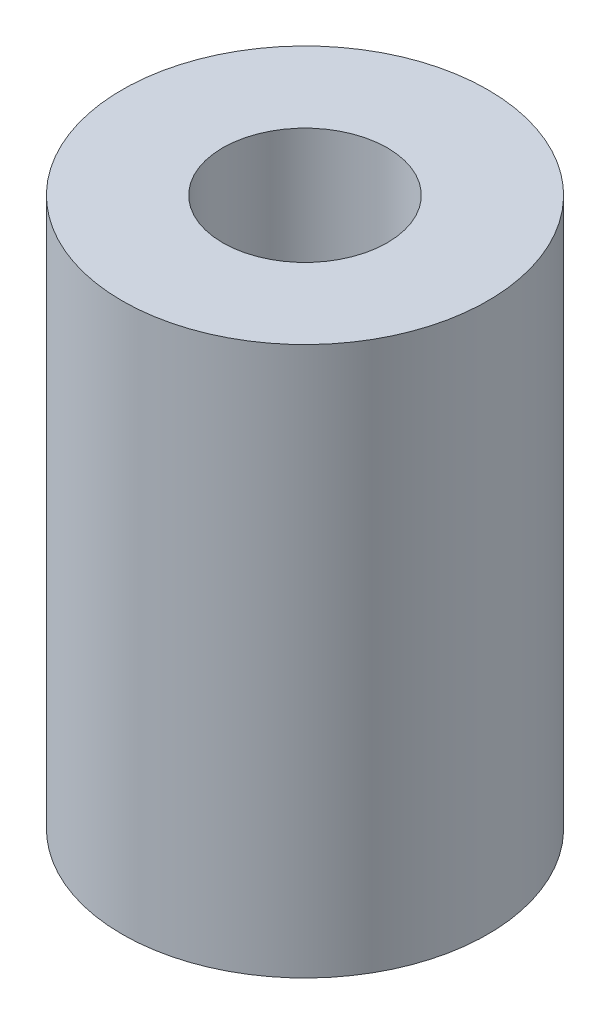
ISO-10303-21;
HEADER;
FILE_DESCRIPTION(('STEP AP214'),'2;1');
FILE_NAME('part.step','',(''),(''),'','','');
FILE_SCHEMA(('AUTOMOTIVE_DESIGN { 1 0 10303 214 1 1 1 1 }'));
ENDSEC;
DATA;
#1=APPLICATION_CONTEXT('core data for automotive mechanical design processes');
#2=APPLICATION_PROTOCOL_DEFINITION('international standard','automotive_design',2000,#1);
#3=PRODUCT_CONTEXT('',#1,'mechanical');
#4=PRODUCT('Part','Part','',(#3));
#5=PRODUCT_RELATED_PRODUCT_CATEGORY('part','',(#4));
#6=PRODUCT_DEFINITION_FORMATION('','',#4);
#7=PRODUCT_DEFINITION_CONTEXT('part definition',#1,'design');
#8=PRODUCT_DEFINITION('design','',#6,#7);
#9=PRODUCT_DEFINITION_SHAPE('','',#8);
#10=(LENGTH_UNIT() NAMED_UNIT(*) SI_UNIT(.MILLI.,.METRE.));
#11=(NAMED_UNIT(*) PLANE_ANGLE_UNIT() SI_UNIT($,.RADIAN.));
#12=(NAMED_UNIT(*) SI_UNIT($,.STERADIAN.) SOLID_ANGLE_UNIT());
#13=UNCERTAINTY_MEASURE_WITH_UNIT(LENGTH_MEASURE(1.E-05),#10,'distance_accuracy_value','');
#14=(GEOMETRIC_REPRESENTATION_CONTEXT(3) GLOBAL_UNCERTAINTY_ASSIGNED_CONTEXT((#13)) GLOBAL_UNIT_ASSIGNED_CONTEXT((#10,
#11,#12)) REPRESENTATION_CONTEXT('',''));
#15=CARTESIAN_POINT('',(0.,0.,0.));
#16=DIRECTION('',(0.,0.,1.));
#17=DIRECTION('',(1.,0.,0.));
#18=AXIS2_PLACEMENT_3D('',#15,#16,#17);
#19=CARTESIAN_POINT('',(0.,0.,0.));
#20=DIRECTION('',(0.,1.,0.));
#21=DIRECTION('',(0.,0.,1.));
#22=AXIS2_PLACEMENT_3D('',#19,#20,#21);
#23=CYLINDRICAL_SURFACE('',#22,5.715);
#24=CARTESIAN_POINT('',(0.,38.1,0.));
#25=DIRECTION('',(0.,1.,0.));
#26=DIRECTION('',(0.,0.,1.));
#27=AXIS2_PLACEMENT_3D('',#24,#25,#26);
#28=CIRCLE('',#27,5.715);
#29=CARTESIAN_POINT('',(0.,38.1,5.715));
#30=VERTEX_POINT('',#29);
#31=EDGE_CURVE('E50',#30,#30,#28,.T.);
#32=CARTESIAN_POINT('',(0.,12.7,0.));
#33=DIRECTION('',(0.,-1.,0.));
#34=DIRECTION('',(0.,0.,-1.));
#35=AXIS2_PLACEMENT_3D('',#32,#33,#34);
#36=CIRCLE('',#35,5.715);
#37=CARTESIAN_POINT('',(0.,12.7,5.715));
#38=VERTEX_POINT('',#37);
#39=EDGE_CURVE('E41',#38,#38,#36,.F.);
#40=CARTESIAN_POINT('',(0.,38.1,5.715));
#41=CARTESIAN_POINT('',(0.,37.8354166666667,5.715));
#42=CARTESIAN_POINT('',(0.,37.5708333333333,5.715));
#43=CARTESIAN_POINT('',(0.,37.0416666666667,5.715));
#44=CARTESIAN_POINT('',(0.,36.7770833333333,5.715));
#45=CARTESIAN_POINT('',(0.,36.2479166666667,5.715));
#46=CARTESIAN_POINT('',(0.,35.9833333333333,5.715));
#47=CARTESIAN_POINT('',(0.,35.4541666666667,5.715));
#48=CARTESIAN_POINT('',(0.,35.1895833333333,5.715));
#49=CARTESIAN_POINT('',(0.,34.6604166666667,5.715));
#50=CARTESIAN_POINT('',(0.,34.3958333333333,5.715));
#51=CARTESIAN_POINT('',(0.,33.8666666666667,5.715));
#52=CARTESIAN_POINT('',(0.,33.6020833333333,5.715));
#53=CARTESIAN_POINT('',(0.,33.0729166666667,5.715));
#54=CARTESIAN_POINT('',(0.,32.8083333333333,5.715));
#55=CARTESIAN_POINT('',(0.,32.2791666666667,5.715));
#56=CARTESIAN_POINT('',(0.,32.0145833333333,5.715));
#57=CARTESIAN_POINT('',(0.,31.4854166666667,5.715));
#58=CARTESIAN_POINT('',(0.,31.2208333333333,5.715));
#59=CARTESIAN_POINT('',(0.,30.6916666666667,5.715));
#60=CARTESIAN_POINT('',(0.,30.4270833333333,5.715));
#61=CARTESIAN_POINT('',(0.,29.8979166666667,5.715));
#62=CARTESIAN_POINT('',(0.,29.6333333333333,5.715));
#63=CARTESIAN_POINT('',(0.,29.1041666666667,5.715));
#64=CARTESIAN_POINT('',(0.,28.8395833333333,5.715));
#65=CARTESIAN_POINT('',(0.,28.3104166666667,5.715));
#66=CARTESIAN_POINT('',(0.,28.0458333333333,5.715));
#67=CARTESIAN_POINT('',(0.,27.5166666666667,5.715));
#68=CARTESIAN_POINT('',(0.,27.2520833333333,5.715));
#69=CARTESIAN_POINT('',(0.,26.7229166666667,5.715));
#70=CARTESIAN_POINT('',(0.,26.4583333333333,5.715));
#71=CARTESIAN_POINT('',(0.,25.9291666666667,5.715));
#72=CARTESIAN_POINT('',(0.,25.6645833333333,5.715));
#73=CARTESIAN_POINT('',(0.,25.1354166666667,5.715));
#74=CARTESIAN_POINT('',(0.,24.8708333333333,5.715));
#75=CARTESIAN_POINT('',(0.,24.3416666666667,5.715));
#76=CARTESIAN_POINT('',(0.,24.0770833333333,5.715));
#77=CARTESIAN_POINT('',(0.,23.5479166666667,5.715));
#78=CARTESIAN_POINT('',(0.,23.2833333333333,5.715));
#79=CARTESIAN_POINT('',(0.,22.7541666666667,5.715));
#80=CARTESIAN_POINT('',(0.,22.4895833333333,5.715));
#81=CARTESIAN_POINT('',(0.,21.9604166666667,5.715));
#82=CARTESIAN_POINT('',(0.,21.6958333333333,5.715));
#83=CARTESIAN_POINT('',(0.,21.1666666666667,5.715));
#84=CARTESIAN_POINT('',(0.,20.9020833333333,5.715));
#85=CARTESIAN_POINT('',(0.,20.3729166666667,5.715));
#86=CARTESIAN_POINT('',(0.,20.1083333333333,5.715));
#87=CARTESIAN_POINT('',(0.,19.5791666666667,5.715));
#88=CARTESIAN_POINT('',(0.,19.3145833333333,5.715));
#89=CARTESIAN_POINT('',(0.,18.7854166666667,5.715));
#90=CARTESIAN_POINT('',(0.,18.5208333333333,5.715));
#91=CARTESIAN_POINT('',(0.,17.9916666666667,5.715));
#92=CARTESIAN_POINT('',(0.,17.7270833333333,5.715));
#93=CARTESIAN_POINT('',(0.,17.1979166666667,5.715));
#94=CARTESIAN_POINT('',(0.,16.9333333333333,5.715));
#95=CARTESIAN_POINT('',(0.,16.4041666666667,5.715));
#96=CARTESIAN_POINT('',(0.,16.1395833333333,5.715));
#97=CARTESIAN_POINT('',(0.,15.6104166666667,5.715));
#98=CARTESIAN_POINT('',(0.,15.3458333333333,5.715));
#99=CARTESIAN_POINT('',(0.,14.8166666666667,5.715));
#100=CARTESIAN_POINT('',(0.,14.5520833333333,5.715));
#101=CARTESIAN_POINT('',(0.,14.0229166666667,5.715));
#102=CARTESIAN_POINT('',(0.,13.7583333333333,5.715));
#103=CARTESIAN_POINT('',(0.,13.2291666666667,5.715));
#104=CARTESIAN_POINT('',(0.,12.9645833333333,5.715));
#105=CARTESIAN_POINT('',(0.,12.7,5.715));
#106=B_SPLINE_CURVE_WITH_KNOTS('',3,(#40,#41,#42,#43,#44,#45,#46,#47,#48,#49,#50,#51,#52,#53,
#54,#55,#56,#57,#58,#59,#60,#61,#62,#63,#64,#65,#66,#67,#68,#69,#70,#71,#72,#73,#74,#75,#76,#77,
#78,#79,#80,#81,#82,#83,#84,#85,#86,#87,#88,#89,#90,#91,#92,#93,#94,#95,#96,#97,#98,#99,#100,
#101,#102,#103,#104,#105),.UNSPECIFIED.,.F.,.F.,(4,2,2,2,2,2,2,2,2,2,2,2,2,2,2,2,2,2,2,2,2,2,2,
2,2,2,2,2,2,2,2,2,4),(0.,0.793750000000003,1.5875,2.38125,3.175,3.96875,4.7625,5.55625,6.35,
7.14375,7.9375,8.73125,9.525,10.31875,11.1125,11.90625,12.7,13.49375,14.2875,15.08125,15.875,
16.66875,17.4625,18.25625,19.05,19.84375,20.6375,21.43125,22.225,23.01875,23.8125,24.60625,
25.4),.UNSPECIFIED.);
#107=EDGE_CURVE('BSEAM37',#30,#38,#106,.T.);
#108=ORIENTED_EDGE('',*,*,#31,.T.);
#109=ORIENTED_EDGE('',*,*,#39,.F.);
#110=ORIENTED_EDGE('',*,*,#107,.T.);
#111=ORIENTED_EDGE('',*,*,#107,.F.);
#112=EDGE_LOOP('',(#108,#110,#109,#111));
#113=FACE_BOUND('',#112,.T.);
#114=ADVANCED_FACE('F37',(#113),#23,.F.);
#115=CARTESIAN_POINT('',(0.,38.1,0.));
#116=DIRECTION('',(0.,-1.,0.));
#117=DIRECTION('',(0.,0.,-1.));
#118=AXIS2_PLACEMENT_3D('',#115,#116,#117);
#119=CYLINDRICAL_SURFACE('',#118,12.7);
#120=CARTESIAN_POINT('',(0.,38.1,0.));
#121=DIRECTION('',(0.,1.,0.));
#122=DIRECTION('',(0.,0.,1.));
#123=AXIS2_PLACEMENT_3D('',#120,#121,#122);
#124=CIRCLE('',#123,12.7);
#125=CARTESIAN_POINT('',(0.,38.1,-12.7));
#126=VERTEX_POINT('',#125);
#127=EDGE_CURVE('E10',#126,#126,#124,.T.);
#128=CARTESIAN_POINT('',(0.,0.,0.));
#129=DIRECTION('',(0.,1.,0.));
#130=DIRECTION('',(0.,0.,1.));
#131=AXIS2_PLACEMENT_3D('',#128,#129,#130);
#132=CIRCLE('',#131,12.7);
#133=CARTESIAN_POINT('',(0.,0.,-12.7));
#134=VERTEX_POINT('',#133);
#135=EDGE_CURVE('E45',#134,#134,#132,.T.);
#136=CARTESIAN_POINT('',(0.,38.1,-12.7));
#137=CARTESIAN_POINT('',(0.,37.703125,-12.7));
#138=CARTESIAN_POINT('',(0.,37.30625,-12.7));
#139=CARTESIAN_POINT('',(0.,36.5125,-12.7));
#140=CARTESIAN_POINT('',(0.,36.115625,-12.7));
#141=CARTESIAN_POINT('',(0.,35.321875,-12.7));
#142=CARTESIAN_POINT('',(0.,34.925,-12.7));
#143=CARTESIAN_POINT('',(0.,34.13125,-12.7));
#144=CARTESIAN_POINT('',(0.,33.734375,-12.7));
#145=CARTESIAN_POINT('',(0.,32.940625,-12.7));
#146=CARTESIAN_POINT('',(0.,32.54375,-12.7));
#147=CARTESIAN_POINT('',(0.,31.75,-12.7));
#148=CARTESIAN_POINT('',(0.,31.353125,-12.7));
#149=CARTESIAN_POINT('',(0.,30.559375,-12.7));
#150=CARTESIAN_POINT('',(0.,30.1625,-12.7));
#151=CARTESIAN_POINT('',(0.,29.36875,-12.7));
#152=CARTESIAN_POINT('',(0.,28.971875,-12.7));
#153=CARTESIAN_POINT('',(0.,28.178125,-12.7));
#154=CARTESIAN_POINT('',(0.,27.78125,-12.7));
#155=CARTESIAN_POINT('',(0.,26.9875,-12.7));
#156=CARTESIAN_POINT('',(0.,26.590625,-12.7));
#157=CARTESIAN_POINT('',(0.,25.796875,-12.7));
#158=CARTESIAN_POINT('',(0.,25.4,-12.7));
#159=CARTESIAN_POINT('',(0.,24.60625,-12.7));
#160=CARTESIAN_POINT('',(0.,24.209375,-12.7));
#161=CARTESIAN_POINT('',(0.,23.415625,-12.7));
#162=CARTESIAN_POINT('',(0.,23.01875,-12.7));
#163=CARTESIAN_POINT('',(0.,22.225,-12.7));
#164=CARTESIAN_POINT('',(0.,21.828125,-12.7));
#165=CARTESIAN_POINT('',(0.,21.034375,-12.7));
#166=CARTESIAN_POINT('',(0.,20.6375,-12.7));
#167=CARTESIAN_POINT('',(0.,19.84375,-12.7));
#168=CARTESIAN_POINT('',(0.,19.446875,-12.7));
#169=CARTESIAN_POINT('',(0.,18.653125,-12.7));
#170=CARTESIAN_POINT('',(0.,18.25625,-12.7));
#171=CARTESIAN_POINT('',(0.,17.4625,-12.7));
#172=CARTESIAN_POINT('',(0.,17.065625,-12.7));
#173=CARTESIAN_POINT('',(0.,16.271875,-12.7));
#174=CARTESIAN_POINT('',(0.,15.875,-12.7));
#175=CARTESIAN_POINT('',(0.,15.08125,-12.7));
#176=CARTESIAN_POINT('',(0.,14.684375,-12.7));
#177=CARTESIAN_POINT('',(0.,13.890625,-12.7));
#178=CARTESIAN_POINT('',(0.,13.49375,-12.7));
#179=CARTESIAN_POINT('',(0.,12.7,-12.7));
#180=CARTESIAN_POINT('',(0.,12.303125,-12.7));
#181=CARTESIAN_POINT('',(0.,11.509375,-12.7));
#182=CARTESIAN_POINT('',(0.,11.1125,-12.7));
#183=CARTESIAN_POINT('',(0.,10.31875,-12.7));
#184=CARTESIAN_POINT('',(0.,9.92187499999999,-12.7));
#185=CARTESIAN_POINT('',(0.,9.128125,-12.7));
#186=CARTESIAN_POINT('',(0.,8.73124999999999,-12.7));
#187=CARTESIAN_POINT('',(0.,7.93749999999999,-12.7));
#188=CARTESIAN_POINT('',(0.,7.54062499999999,-12.7));
#189=CARTESIAN_POINT('',(0.,6.746875,-12.7));
#190=CARTESIAN_POINT('',(0.,6.35,-12.7));
#191=CARTESIAN_POINT('',(0.,5.55625,-12.7));
#192=CARTESIAN_POINT('',(0.,5.159375,-12.7));
#193=CARTESIAN_POINT('',(0.,4.365625,-12.7));
#194=CARTESIAN_POINT('',(0.,3.96875,-12.7));
#195=CARTESIAN_POINT('',(0.,3.175,-12.7));
#196=CARTESIAN_POINT('',(0.,2.778125,-12.7));
#197=CARTESIAN_POINT('',(0.,1.984375,-12.7));
#198=CARTESIAN_POINT('',(0.,1.5875,-12.7));
#199=CARTESIAN_POINT('',(0.,0.79375,-12.7));
#200=CARTESIAN_POINT('',(0.,0.396875,-12.7));
#201=CARTESIAN_POINT('',(0.,0.,-12.7));
#202=B_SPLINE_CURVE_WITH_KNOTS('',3,(#136,#137,#138,#139,#140,#141,#142,#143,#144,#145,#146,
#147,#148,#149,#150,#151,#152,#153,#154,#155,#156,#157,#158,#159,#160,#161,#162,#163,#164,#165,
#166,#167,#168,#169,#170,#171,#172,#173,#174,#175,#176,#177,#178,#179,#180,#181,#182,#183,#184,
#185,#186,#187,#188,#189,#190,#191,#192,#193,#194,#195,#196,#197,#198,#199,#200,#201),
.UNSPECIFIED.,.F.,.F.,(4,2,2,2,2,2,2,2,2,2,2,2,2,2,2,2,2,2,2,2,2,2,2,2,2,2,2,2,2,2,2,2,4),(0.,
1.190625,2.38125,3.571875,4.7625,5.953125,7.14375,8.334375,9.52500000000001,10.715625,11.90625,
13.096875,14.2875,15.478125,16.66875,17.859375,19.05,20.240625,21.43125,22.621875,23.8125,
25.003125,26.19375,27.384375,28.575,29.765625,30.95625,32.146875,33.3375,34.528125,35.71875,
36.909375,38.1),.UNSPECIFIED.);
#203=EDGE_CURVE('BSEAM39',#126,#134,#202,.T.);
#204=ORIENTED_EDGE('',*,*,#127,.F.);
#205=ORIENTED_EDGE('',*,*,#135,.T.);
#206=ORIENTED_EDGE('',*,*,#203,.T.);
#207=ORIENTED_EDGE('',*,*,#203,.F.);
#208=EDGE_LOOP('',(#204,#206,#205,#207));
#209=FACE_BOUND('',#208,.T.);
#210=ADVANCED_FACE('F39',(#209),#119,.T.);
#211=CARTESIAN_POINT('',(0.,38.1,0.));
#212=DIRECTION('',(0.,1.,0.));
#213=DIRECTION('',(0.,0.,1.));
#214=AXIS2_PLACEMENT_3D('',#211,#212,#213);
#215=PLANE('',#214);
#216=ORIENTED_EDGE('',*,*,#31,.F.);
#217=EDGE_LOOP('',(#216));
#218=FACE_BOUND('',#217,.T.);
#219=ORIENTED_EDGE('',*,*,#127,.T.);
#220=EDGE_LOOP('',(#219));
#221=FACE_BOUND('',#220,.T.);
#222=ADVANCED_FACE('F74',(#218,#221),#215,.T.);
#223=CARTESIAN_POINT('',(0.,0.,0.));
#224=DIRECTION('',(0.,1.,0.));
#225=DIRECTION('',(0.,0.,1.));
#226=AXIS2_PLACEMENT_3D('',#223,#224,#225);
#227=PLANE('',#226);
#228=CARTESIAN_POINT('',(0.,0.,0.));
#229=DIRECTION('',(0.,-1.,0.));
#230=DIRECTION('',(0.,0.,-1.));
#231=AXIS2_PLACEMENT_3D('',#228,#229,#230);
#232=CIRCLE('',#231,9.3345);
#233=CARTESIAN_POINT('',(0.,0.,-9.3345));
#234=VERTEX_POINT('',#233);
#235=EDGE_CURVE('E54',#234,#234,#232,.T.);
#236=ORIENTED_EDGE('',*,*,#235,.F.);
#237=EDGE_LOOP('',(#236));
#238=FACE_BOUND('',#237,.T.);
#239=ORIENTED_EDGE('',*,*,#135,.F.);
#240=EDGE_LOOP('',(#239));
#241=FACE_BOUND('',#240,.T.);
#242=ADVANCED_FACE('F80',(#238,#241),#227,.F.);
#243=CARTESIAN_POINT('',(0.,12.7,0.));
#244=DIRECTION('',(0.,-1.,0.));
#245=DIRECTION('',(0.,0.,-1.));
#246=AXIS2_PLACEMENT_3D('',#243,#244,#245);
#247=PLANE('',#246);
#248=CARTESIAN_POINT('',(0.,12.7,0.));
#249=DIRECTION('',(0.,-1.,0.));
#250=DIRECTION('',(0.,0.,-1.));
#251=AXIS2_PLACEMENT_3D('',#248,#249,#250);
#252=CIRCLE('',#251,9.3345);
#253=CARTESIAN_POINT('',(0.,12.7,-9.3345));
#254=VERTEX_POINT('',#253);
#255=EDGE_CURVE('E57',#254,#254,#252,.T.);
#256=ORIENTED_EDGE('',*,*,#255,.T.);
#257=EDGE_LOOP('',(#256));
#258=FACE_BOUND('',#257,.T.);
#259=ORIENTED_EDGE('',*,*,#39,.T.);
#260=EDGE_LOOP('',(#259));
#261=FACE_BOUND('',#260,.T.);
#262=ADVANCED_FACE('F64',(#258,#261),#247,.T.);
#263=CARTESIAN_POINT('',(0.,12.7,0.));
#264=DIRECTION('',(0.,-1.,0.));
#265=DIRECTION('',(0.,0.,-1.));
#266=AXIS2_PLACEMENT_3D('',#263,#264,#265);
#267=CYLINDRICAL_SURFACE('',#266,9.3345);
#268=ORIENTED_EDGE('',*,*,#255,.F.);
#269=EDGE_LOOP('',(#268));
#270=FACE_BOUND('',#269,.T.);
#271=ORIENTED_EDGE('',*,*,#235,.T.);
#272=EDGE_LOOP('',(#271));
#273=FACE_BOUND('',#272,.T.);
#274=ADVANCED_FACE('F78',(#270,#273),#267,.F.);
#275=CLOSED_SHELL('',(#114,#210,#222,#242,#262,#274));
#276=MANIFOLD_SOLID_BREP('B2',#275);
#277=ADVANCED_BREP_SHAPE_REPRESENTATION('',(#18,#276),#14);
#278=SHAPE_DEFINITION_REPRESENTATION(#9,#277);
ENDSEC;
END-ISO-10303-21;
